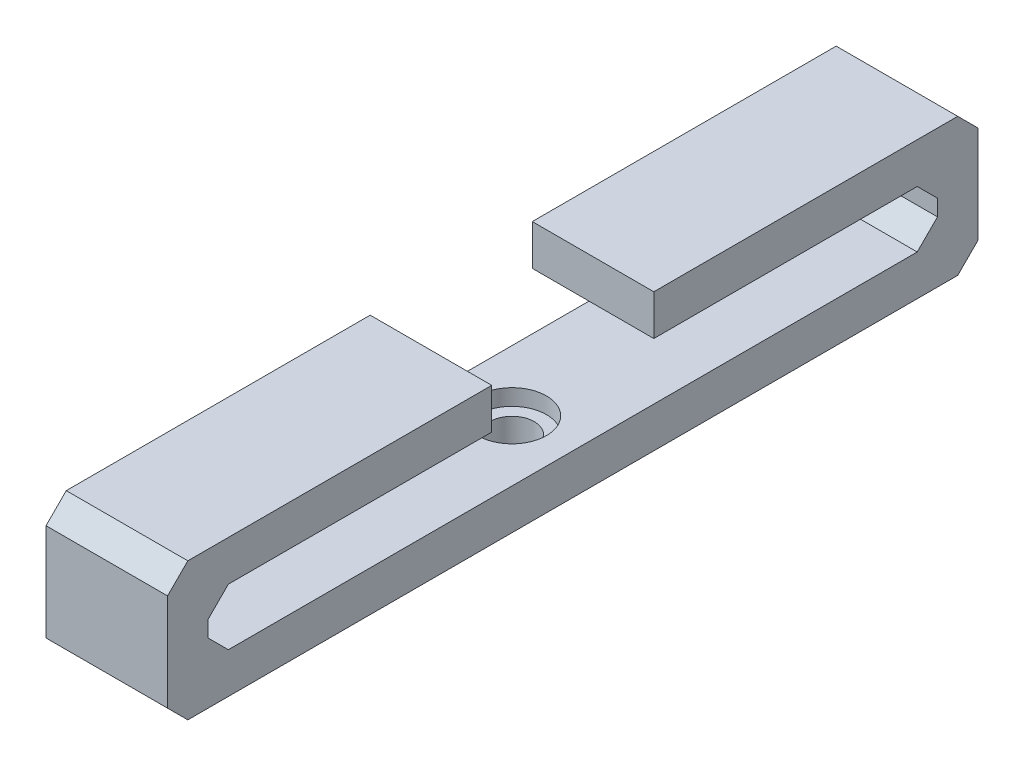
ISO-10303-21;
HEADER;
FILE_DESCRIPTION(('STEP AP214'),'2;1');
FILE_NAME('part.step','',(''),(''),'','','');
FILE_SCHEMA(('AUTOMOTIVE_DESIGN { 1 0 10303 214 1 1 1 1 }'));
ENDSEC;
DATA;
#1=APPLICATION_CONTEXT('core data for automotive mechanical design processes');
#2=APPLICATION_PROTOCOL_DEFINITION('international standard','automotive_design',2000,#1);
#3=PRODUCT_CONTEXT('',#1,'mechanical');
#4=PRODUCT('Part','Part','',(#3));
#5=PRODUCT_RELATED_PRODUCT_CATEGORY('part','',(#4));
#6=PRODUCT_DEFINITION_FORMATION('','',#4);
#7=PRODUCT_DEFINITION_CONTEXT('part definition',#1,'design');
#8=PRODUCT_DEFINITION('design','',#6,#7);
#9=PRODUCT_DEFINITION_SHAPE('','',#8);
#10=(LENGTH_UNIT() NAMED_UNIT(*) SI_UNIT(.MILLI.,.METRE.));
#11=(NAMED_UNIT(*) PLANE_ANGLE_UNIT() SI_UNIT($,.RADIAN.));
#12=(NAMED_UNIT(*) SI_UNIT($,.STERADIAN.) SOLID_ANGLE_UNIT());
#13=UNCERTAINTY_MEASURE_WITH_UNIT(LENGTH_MEASURE(1.E-05),#10,'distance_accuracy_value','');
#14=(GEOMETRIC_REPRESENTATION_CONTEXT(3) GLOBAL_UNCERTAINTY_ASSIGNED_CONTEXT((#13)) GLOBAL_UNIT_ASSIGNED_CONTEXT((#10,
#11,#12)) REPRESENTATION_CONTEXT('',''));
#15=CARTESIAN_POINT('',(0.,0.,0.));
#16=DIRECTION('',(0.,0.,1.));
#17=DIRECTION('',(1.,0.,0.));
#18=AXIS2_PLACEMENT_3D('',#15,#16,#17);
#19=CARTESIAN_POINT('',(0.,0.,0.));
#20=DIRECTION('',(0.,1.,0.));
#21=DIRECTION('',(0.,0.,1.));
#22=AXIS2_PLACEMENT_3D('',#19,#20,#21);
#23=CYLINDRICAL_SURFACE('',#22,2.75);
#24=CARTESIAN_POINT('',(0.,0.,0.));
#25=DIRECTION('',(0.,1.,0.));
#26=DIRECTION('',(0.,0.,1.));
#27=AXIS2_PLACEMENT_3D('',#24,#25,#26);
#28=CIRCLE('',#27,2.75);
#29=CARTESIAN_POINT('',(0.,0.,2.75));
#30=VERTEX_POINT('',#29);
#31=EDGE_CURVE('E369',#30,#30,#28,.T.);
#32=ORIENTED_EDGE('',*,*,#31,.F.);
#33=EDGE_LOOP('',(#32));
#34=FACE_BOUND('',#33,.T.);
#35=CARTESIAN_POINT('',(0.,3.,0.));
#36=DIRECTION('',(0.,1.,0.));
#37=DIRECTION('',(0.,0.,1.));
#38=AXIS2_PLACEMENT_3D('',#35,#36,#37);
#39=CIRCLE('',#38,2.75);
#40=CARTESIAN_POINT('',(0.,3.,2.75));
#41=VERTEX_POINT('',#40);
#42=EDGE_CURVE('E46',#41,#41,#39,.F.);
#43=ORIENTED_EDGE('',*,*,#42,.F.);
#44=EDGE_LOOP('',(#43));
#45=FACE_BOUND('',#44,.T.);
#46=ADVANCED_FACE('F41',(#34,#45),#23,.F.);
#47=CARTESIAN_POINT('',(7.5,17.,-50.));
#48=DIRECTION('',(0.,-1.,0.));
#49=DIRECTION('',(0.,0.,-1.));
#50=AXIS2_PLACEMENT_3D('',#47,#48,#49);
#51=PLANE('',#50);
#52=DIRECTION('',(0.,0.,1.));
#53=VECTOR('',#52,1.);
#54=CARTESIAN_POINT('',(7.5,17.,-50.));
#55=LINE('',#54,#53);
#56=CARTESIAN_POINT('',(7.5,17.,-47.5));
#57=VERTEX_POINT('',#56);
#58=CARTESIAN_POINT('',(7.5,17.,-10.));
#59=VERTEX_POINT('',#58);
#60=EDGE_CURVE('E180',#57,#59,#55,.T.);
#61=ORIENTED_EDGE('',*,*,#60,.F.);
#62=DIRECTION('',(-1.,0.,0.));
#63=VECTOR('',#62,1.);
#64=CARTESIAN_POINT('',(7.5,17.,-47.5));
#65=LINE('',#64,#63);
#66=CARTESIAN_POINT('',(-7.5,17.,-47.5));
#67=VERTEX_POINT('',#66);
#68=EDGE_CURVE('E284',#57,#67,#65,.T.);
#69=ORIENTED_EDGE('',*,*,#68,.T.);
#70=DIRECTION('',(0.,0.,1.));
#71=VECTOR('',#70,1.);
#72=CARTESIAN_POINT('',(-7.5,17.,-50.));
#73=LINE('',#72,#71);
#74=CARTESIAN_POINT('',(-7.5,17.,-10.));
#75=VERTEX_POINT('',#74);
#76=EDGE_CURVE('E209',#67,#75,#73,.T.);
#77=ORIENTED_EDGE('',*,*,#76,.T.);
#78=DIRECTION('',(-1.,0.,0.));
#79=VECTOR('',#78,1.);
#80=CARTESIAN_POINT('',(7.5,17.,-10.));
#81=LINE('',#80,#79);
#82=EDGE_CURVE('E200',#59,#75,#81,.T.);
#83=ORIENTED_EDGE('',*,*,#82,.F.);
#84=EDGE_LOOP('',(#61,#69,#77,#83));
#85=FACE_BOUND('',#84,.T.);
#86=ADVANCED_FACE('F207',(#85),#51,.F.);
#87=CARTESIAN_POINT('',(7.5,17.,-10.));
#88=DIRECTION('',(0.,0.,-1.));
#89=DIRECTION('',(0.,1.,0.));
#90=AXIS2_PLACEMENT_3D('',#87,#88,#89);
#91=PLANE('',#90);
#92=DIRECTION('',(0.,-1.,0.));
#93=VECTOR('',#92,1.);
#94=CARTESIAN_POINT('',(-7.5,17.,-10.));
#95=LINE('',#94,#93);
#96=CARTESIAN_POINT('',(-7.5,12.,-10.));
#97=VERTEX_POINT('',#96);
#98=EDGE_CURVE('E368',#75,#97,#95,.T.);
#99=ORIENTED_EDGE('',*,*,#98,.T.);
#100=DIRECTION('',(-1.,0.,0.));
#101=VECTOR('',#100,1.);
#102=CARTESIAN_POINT('',(7.5,12.,-10.));
#103=LINE('',#102,#101);
#104=CARTESIAN_POINT('',(7.5,12.,-10.));
#105=VERTEX_POINT('',#104);
#106=EDGE_CURVE('E202',#105,#97,#103,.T.);
#107=ORIENTED_EDGE('',*,*,#106,.F.);
#108=DIRECTION('',(0.,-1.,0.));
#109=VECTOR('',#108,1.);
#110=CARTESIAN_POINT('',(7.5,17.,-10.));
#111=LINE('',#110,#109);
#112=EDGE_CURVE('E185',#59,#105,#111,.T.);
#113=ORIENTED_EDGE('',*,*,#112,.F.);
#114=ORIENTED_EDGE('',*,*,#82,.T.);
#115=EDGE_LOOP('',(#99,#107,#113,#114));
#116=FACE_BOUND('',#115,.T.);
#117=ADVANCED_FACE('F199',(#116),#91,.F.);
#118=CARTESIAN_POINT('',(7.5,12.,-10.));
#119=DIRECTION('',(0.,1.,0.));
#120=DIRECTION('',(0.,0.,1.));
#121=AXIS2_PLACEMENT_3D('',#118,#119,#120);
#122=PLANE('',#121);
#123=DIRECTION('',(0.,0.,-1.));
#124=VECTOR('',#123,1.);
#125=CARTESIAN_POINT('',(-7.5,12.,-10.));
#126=LINE('',#125,#124);
#127=CARTESIAN_POINT('',(-7.5,12.,-42.5));
#128=VERTEX_POINT('',#127);
#129=EDGE_CURVE('E372',#97,#128,#126,.T.);
#130=ORIENTED_EDGE('',*,*,#129,.T.);
#131=DIRECTION('',(1.,0.,0.));
#132=VECTOR('',#131,1.);
#133=CARTESIAN_POINT('',(7.5,12.,-42.5));
#134=LINE('',#133,#132);
#135=CARTESIAN_POINT('',(7.5,12.,-42.5));
#136=VERTEX_POINT('',#135);
#137=EDGE_CURVE('E281',#128,#136,#134,.T.);
#138=ORIENTED_EDGE('',*,*,#137,.T.);
#139=DIRECTION('',(0.,0.,-1.));
#140=VECTOR('',#139,1.);
#141=CARTESIAN_POINT('',(7.5,12.,-10.));
#142=LINE('',#141,#140);
#143=EDGE_CURVE('E205',#105,#136,#142,.T.);
#144=ORIENTED_EDGE('',*,*,#143,.F.);
#145=ORIENTED_EDGE('',*,*,#106,.T.);
#146=EDGE_LOOP('',(#130,#138,#144,#145));
#147=FACE_BOUND('',#146,.T.);
#148=ADVANCED_FACE('F486',(#147),#122,.F.);
#149=CARTESIAN_POINT('',(7.5,12.,-45.));
#150=DIRECTION('',(0.,0.,-1.));
#151=DIRECTION('',(-1.,0.,0.));
#152=AXIS2_PLACEMENT_3D('',#149,#150,#151);
#153=PLANE('',#152);
#154=DIRECTION('',(0.,-1.,0.));
#155=VECTOR('',#154,1.);
#156=CARTESIAN_POINT('',(-7.5,12.,-45.));
#157=LINE('',#156,#155);
#158=CARTESIAN_POINT('',(-7.5,9.49999999999998,-45.));
#159=VERTEX_POINT('',#158);
#160=CARTESIAN_POINT('',(-7.5,7.5,-45.));
#161=VERTEX_POINT('',#160);
#162=EDGE_CURVE('E376',#159,#161,#157,.T.);
#163=ORIENTED_EDGE('',*,*,#162,.T.);
#164=DIRECTION('',(1.,0.,0.));
#165=VECTOR('',#164,1.);
#166=CARTESIAN_POINT('',(7.5,7.5,-45.));
#167=LINE('',#166,#165);
#168=CARTESIAN_POINT('',(7.5,7.5,-45.));
#169=VERTEX_POINT('',#168);
#170=EDGE_CURVE('E265',#161,#169,#167,.T.);
#171=ORIENTED_EDGE('',*,*,#170,.T.);
#172=DIRECTION('',(0.,-1.,0.));
#173=VECTOR('',#172,1.);
#174=CARTESIAN_POINT('',(7.5,12.,-45.));
#175=LINE('',#174,#173);
#176=CARTESIAN_POINT('',(7.5,9.49999999999998,-45.));
#177=VERTEX_POINT('',#176);
#178=EDGE_CURVE('E536',#177,#169,#175,.T.);
#179=ORIENTED_EDGE('',*,*,#178,.F.);
#180=DIRECTION('',(-1.,0.,0.));
#181=VECTOR('',#180,1.);
#182=CARTESIAN_POINT('',(-7.5,9.49999999999998,-45.));
#183=LINE('',#182,#181);
#184=EDGE_CURVE('E261',#177,#159,#183,.T.);
#185=ORIENTED_EDGE('',*,*,#184,.T.);
#186=EDGE_LOOP('',(#163,#171,#179,#185));
#187=FACE_BOUND('',#186,.T.);
#188=ADVANCED_FACE('F482',(#187),#153,.F.);
#189=CARTESIAN_POINT('',(7.5,5.,-45.));
#190=DIRECTION('',(0.,-1.,0.));
#191=DIRECTION('',(0.,0.,-1.));
#192=AXIS2_PLACEMENT_3D('',#189,#190,#191);
#193=PLANE('',#192);
#194=CARTESIAN_POINT('',(0.,5.,0.));
#195=DIRECTION('',(0.,1.,0.));
#196=DIRECTION('',(0.,0.,1.));
#197=AXIS2_PLACEMENT_3D('',#194,#195,#196);
#198=CIRCLE('',#197,4.25);
#199=CARTESIAN_POINT('',(0.,5.,4.25));
#200=VERTEX_POINT('',#199);
#201=EDGE_CURVE('E545',#200,#200,#198,.T.);
#202=ORIENTED_EDGE('',*,*,#201,.F.);
#203=EDGE_LOOP('',(#202));
#204=FACE_BOUND('',#203,.T.);
#205=DIRECTION('',(0.,0.,1.));
#206=VECTOR('',#205,1.);
#207=CARTESIAN_POINT('',(7.5,5.,-45.));
#208=LINE('',#207,#206);
#209=CARTESIAN_POINT('',(7.5,5.,-42.5));
#210=VERTEX_POINT('',#209);
#211=CARTESIAN_POINT('',(7.5,5.,42.5));
#212=VERTEX_POINT('',#211);
#213=EDGE_CURVE('E350',#210,#212,#208,.T.);
#214=ORIENTED_EDGE('',*,*,#213,.F.);
#215=DIRECTION('',(-1.,0.,0.));
#216=VECTOR('',#215,1.);
#217=CARTESIAN_POINT('',(-7.5,5.,-42.5));
#218=LINE('',#217,#216);
#219=CARTESIAN_POINT('',(-7.5,5.,-42.5));
#220=VERTEX_POINT('',#219);
#221=EDGE_CURVE('E257',#210,#220,#218,.T.);
#222=ORIENTED_EDGE('',*,*,#221,.T.);
#223=DIRECTION('',(0.,0.,1.));
#224=VECTOR('',#223,1.);
#225=CARTESIAN_POINT('',(-7.5,5.,-45.));
#226=LINE('',#225,#224);
#227=CARTESIAN_POINT('',(-7.5,5.,42.5));
#228=VERTEX_POINT('',#227);
#229=EDGE_CURVE('E331',#220,#228,#226,.T.);
#230=ORIENTED_EDGE('',*,*,#229,.T.);
#231=DIRECTION('',(1.,0.,0.));
#232=VECTOR('',#231,1.);
#233=CARTESIAN_POINT('',(7.5,5.,42.5));
#234=LINE('',#233,#232);
#235=EDGE_CURVE('E254',#228,#212,#234,.T.);
#236=ORIENTED_EDGE('',*,*,#235,.T.);
#237=EDGE_LOOP('',(#214,#222,#230,#236));
#238=FACE_BOUND('',#237,.T.);
#239=ADVANCED_FACE('F479',(#204,#238),#193,.F.);
#240=CARTESIAN_POINT('',(7.5,12.,45.));
#241=DIRECTION('',(0.,0.,1.));
#242=DIRECTION('',(1.,0.,0.));
#243=AXIS2_PLACEMENT_3D('',#240,#241,#242);
#244=PLANE('',#243);
#245=DIRECTION('',(0.,1.,0.));
#246=VECTOR('',#245,1.);
#247=CARTESIAN_POINT('',(7.5,12.,45.));
#248=LINE('',#247,#246);
#249=CARTESIAN_POINT('',(7.5,7.50000000000001,45.));
#250=VERTEX_POINT('',#249);
#251=CARTESIAN_POINT('',(7.5,9.49999999999999,45.));
#252=VERTEX_POINT('',#251);
#253=EDGE_CURVE('E338',#250,#252,#248,.T.);
#254=ORIENTED_EDGE('',*,*,#253,.F.);
#255=DIRECTION('',(-1.,0.,0.));
#256=VECTOR('',#255,1.);
#257=CARTESIAN_POINT('',(-7.5,7.50000000000001,45.));
#258=LINE('',#257,#256);
#259=CARTESIAN_POINT('',(-7.5,7.50000000000001,45.));
#260=VERTEX_POINT('',#259);
#261=EDGE_CURVE('E277',#250,#260,#258,.T.);
#262=ORIENTED_EDGE('',*,*,#261,.T.);
#263=DIRECTION('',(0.,1.,0.));
#264=VECTOR('',#263,1.);
#265=CARTESIAN_POINT('',(-7.5,12.,45.));
#266=LINE('',#265,#264);
#267=CARTESIAN_POINT('',(-7.5,9.49999999999999,45.));
#268=VERTEX_POINT('',#267);
#269=EDGE_CURVE('E319',#260,#268,#266,.T.);
#270=ORIENTED_EDGE('',*,*,#269,.T.);
#271=DIRECTION('',(1.,0.,0.));
#272=VECTOR('',#271,1.);
#273=CARTESIAN_POINT('',(7.5,9.49999999999999,45.));
#274=LINE('',#273,#272);
#275=EDGE_CURVE('E274',#268,#252,#274,.T.);
#276=ORIENTED_EDGE('',*,*,#275,.T.);
#277=EDGE_LOOP('',(#254,#262,#270,#276));
#278=FACE_BOUND('',#277,.T.);
#279=ADVANCED_FACE('F327',(#278),#244,.F.);
#280=CARTESIAN_POINT('',(7.5,12.,10.));
#281=DIRECTION('',(0.,1.,0.));
#282=DIRECTION('',(0.,0.,1.));
#283=AXIS2_PLACEMENT_3D('',#280,#281,#282);
#284=PLANE('',#283);
#285=DIRECTION('',(0.,0.,-1.));
#286=VECTOR('',#285,1.);
#287=CARTESIAN_POINT('',(7.5,12.,10.));
#288=LINE('',#287,#286);
#289=CARTESIAN_POINT('',(7.5,12.,42.5));
#290=VERTEX_POINT('',#289);
#291=CARTESIAN_POINT('',(7.5,12.,10.));
#292=VERTEX_POINT('',#291);
#293=EDGE_CURVE('E336',#290,#292,#288,.T.);
#294=ORIENTED_EDGE('',*,*,#293,.F.);
#295=DIRECTION('',(-1.,0.,0.));
#296=VECTOR('',#295,1.);
#297=CARTESIAN_POINT('',(-7.5,12.,42.5));
#298=LINE('',#297,#296);
#299=CARTESIAN_POINT('',(-7.5,12.,42.5));
#300=VERTEX_POINT('',#299);
#301=EDGE_CURVE('E287',#290,#300,#298,.T.);
#302=ORIENTED_EDGE('',*,*,#301,.T.);
#303=DIRECTION('',(0.,0.,-1.));
#304=VECTOR('',#303,1.);
#305=CARTESIAN_POINT('',(-7.5,12.,10.));
#306=LINE('',#305,#304);
#307=CARTESIAN_POINT('',(-7.5,12.,10.));
#308=VERTEX_POINT('',#307);
#309=EDGE_CURVE('E321',#300,#308,#306,.T.);
#310=ORIENTED_EDGE('',*,*,#309,.T.);
#311=DIRECTION('',(-1.,0.,0.));
#312=VECTOR('',#311,1.);
#313=CARTESIAN_POINT('',(7.5,12.,10.));
#314=LINE('',#313,#312);
#315=EDGE_CURVE('E218',#292,#308,#314,.T.);
#316=ORIENTED_EDGE('',*,*,#315,.F.);
#317=EDGE_LOOP('',(#294,#302,#310,#316));
#318=FACE_BOUND('',#317,.T.);
#319=ADVANCED_FACE('F340',(#318),#284,.F.);
#320=CARTESIAN_POINT('',(7.5,17.,10.));
#321=DIRECTION('',(0.,0.,1.));
#322=DIRECTION('',(0.,-1.,0.));
#323=AXIS2_PLACEMENT_3D('',#320,#321,#322);
#324=PLANE('',#323);
#325=DIRECTION('',(0.,1.,0.));
#326=VECTOR('',#325,1.);
#327=CARTESIAN_POINT('',(-7.5,17.,10.));
#328=LINE('',#327,#326);
#329=CARTESIAN_POINT('',(-7.5,17.,10.));
#330=VERTEX_POINT('',#329);
#331=EDGE_CURVE('E385',#308,#330,#328,.T.);
#332=ORIENTED_EDGE('',*,*,#331,.T.);
#333=DIRECTION('',(-1.,0.,0.));
#334=VECTOR('',#333,1.);
#335=CARTESIAN_POINT('',(7.5,17.,10.));
#336=LINE('',#335,#334);
#337=CARTESIAN_POINT('',(7.5,17.,10.));
#338=VERTEX_POINT('',#337);
#339=EDGE_CURVE('E365',#338,#330,#336,.T.);
#340=ORIENTED_EDGE('',*,*,#339,.F.);
#341=DIRECTION('',(0.,1.,0.));
#342=VECTOR('',#341,1.);
#343=CARTESIAN_POINT('',(7.5,17.,10.));
#344=LINE('',#343,#342);
#345=EDGE_CURVE('E344',#292,#338,#344,.T.);
#346=ORIENTED_EDGE('',*,*,#345,.F.);
#347=ORIENTED_EDGE('',*,*,#315,.T.);
#348=EDGE_LOOP('',(#332,#340,#346,#347));
#349=FACE_BOUND('',#348,.T.);
#350=ADVANCED_FACE('F406',(#349),#324,.F.);
#351=CARTESIAN_POINT('',(7.5,17.,50.));
#352=DIRECTION('',(0.,-1.,0.));
#353=DIRECTION('',(0.,0.,-1.));
#354=AXIS2_PLACEMENT_3D('',#351,#352,#353);
#355=PLANE('',#354);
#356=DIRECTION('',(0.,0.,1.));
#357=VECTOR('',#356,1.);
#358=CARTESIAN_POINT('',(-7.5,17.,50.));
#359=LINE('',#358,#357);
#360=CARTESIAN_POINT('',(-7.5,17.,47.5));
#361=VERTEX_POINT('',#360);
#362=EDGE_CURVE('E388',#330,#361,#359,.T.);
#363=ORIENTED_EDGE('',*,*,#362,.T.);
#364=DIRECTION('',(1.,0.,0.));
#365=VECTOR('',#364,1.);
#366=CARTESIAN_POINT('',(7.5,17.,47.5));
#367=LINE('',#366,#365);
#368=CARTESIAN_POINT('',(7.5,17.,47.5));
#369=VERTEX_POINT('',#368);
#370=EDGE_CURVE('E291',#361,#369,#367,.T.);
#371=ORIENTED_EDGE('',*,*,#370,.T.);
#372=DIRECTION('',(0.,0.,1.));
#373=VECTOR('',#372,1.);
#374=CARTESIAN_POINT('',(7.5,17.,50.));
#375=LINE('',#374,#373);
#376=EDGE_CURVE('E348',#338,#369,#375,.T.);
#377=ORIENTED_EDGE('',*,*,#376,.F.);
#378=ORIENTED_EDGE('',*,*,#339,.T.);
#379=EDGE_LOOP('',(#363,#371,#377,#378));
#380=FACE_BOUND('',#379,.T.);
#381=ADVANCED_FACE('F412',(#380),#355,.F.);
#382=CARTESIAN_POINT('',(7.5,0.,50.));
#383=DIRECTION('',(0.,0.,-1.));
#384=DIRECTION('',(-1.,0.,0.));
#385=AXIS2_PLACEMENT_3D('',#382,#383,#384);
#386=PLANE('',#385);
#387=DIRECTION('',(0.,-1.,0.));
#388=VECTOR('',#387,1.);
#389=CARTESIAN_POINT('',(-7.5,0.,50.));
#390=LINE('',#389,#388);
#391=CARTESIAN_POINT('',(-7.5,14.5,50.));
#392=VERTEX_POINT('',#391);
#393=CARTESIAN_POINT('',(-7.5,2.50000000000003,50.));
#394=VERTEX_POINT('',#393);
#395=EDGE_CURVE('E392',#392,#394,#390,.T.);
#396=ORIENTED_EDGE('',*,*,#395,.T.);
#397=DIRECTION('',(1.,0.,0.));
#398=VECTOR('',#397,1.);
#399=CARTESIAN_POINT('',(7.5,2.50000000000003,50.));
#400=LINE('',#399,#398);
#401=CARTESIAN_POINT('',(7.5,2.50000000000003,50.));
#402=VERTEX_POINT('',#401);
#403=EDGE_CURVE('E59',#394,#402,#400,.T.);
#404=ORIENTED_EDGE('',*,*,#403,.T.);
#405=DIRECTION('',(0.,-1.,0.));
#406=VECTOR('',#405,1.);
#407=CARTESIAN_POINT('',(7.5,0.,50.));
#408=LINE('',#407,#406);
#409=CARTESIAN_POINT('',(7.5,14.5,50.));
#410=VERTEX_POINT('',#409);
#411=EDGE_CURVE('E356',#410,#402,#408,.T.);
#412=ORIENTED_EDGE('',*,*,#411,.F.);
#413=DIRECTION('',(-1.,0.,0.));
#414=VECTOR('',#413,1.);
#415=CARTESIAN_POINT('',(7.5,14.5,50.));
#416=LINE('',#415,#414);
#417=EDGE_CURVE('E268',#410,#392,#416,.T.);
#418=ORIENTED_EDGE('',*,*,#417,.T.);
#419=EDGE_LOOP('',(#396,#404,#412,#418));
#420=FACE_BOUND('',#419,.T.);
#421=ADVANCED_FACE('F416',(#420),#386,.F.);
#422=CARTESIAN_POINT('',(7.5,0.,50.));
#423=DIRECTION('',(0.,1.,0.));
#424=DIRECTION('',(0.,0.,1.));
#425=AXIS2_PLACEMENT_3D('',#422,#423,#424);
#426=PLANE('',#425);
#427=ORIENTED_EDGE('',*,*,#31,.T.);
#428=EDGE_LOOP('',(#427));
#429=FACE_BOUND('',#428,.T.);
#430=DIRECTION('',(0.,0.,-1.));
#431=VECTOR('',#430,1.);
#432=CARTESIAN_POINT('',(-7.5,0.,50.));
#433=LINE('',#432,#431);
#434=CARTESIAN_POINT('',(-7.5,0.,47.5));
#435=VERTEX_POINT('',#434);
#436=CARTESIAN_POINT('',(-7.5,0.,-47.5));
#437=VERTEX_POINT('',#436);
#438=EDGE_CURVE('E395',#435,#437,#433,.T.);
#439=ORIENTED_EDGE('',*,*,#438,.T.);
#440=DIRECTION('',(1.,0.,0.));
#441=VECTOR('',#440,1.);
#442=CARTESIAN_POINT('',(7.5,0.,-47.5));
#443=LINE('',#442,#441);
#444=CARTESIAN_POINT('',(7.5,0.,-47.5));
#445=VERTEX_POINT('',#444);
#446=EDGE_CURVE('E241',#437,#445,#443,.T.);
#447=ORIENTED_EDGE('',*,*,#446,.T.);
#448=DIRECTION('',(0.,0.,-1.));
#449=VECTOR('',#448,1.);
#450=CARTESIAN_POINT('',(7.5,0.,50.));
#451=LINE('',#450,#449);
#452=CARTESIAN_POINT('',(7.5,0.,47.5));
#453=VERTEX_POINT('',#452);
#454=EDGE_CURVE('E359',#453,#445,#451,.T.);
#455=ORIENTED_EDGE('',*,*,#454,.F.);
#456=DIRECTION('',(-1.,0.,0.));
#457=VECTOR('',#456,1.);
#458=CARTESIAN_POINT('',(7.5,0.,47.5));
#459=LINE('',#458,#457);
#460=EDGE_CURVE('E237',#453,#435,#459,.T.);
#461=ORIENTED_EDGE('',*,*,#460,.T.);
#462=EDGE_LOOP('',(#439,#447,#455,#461));
#463=FACE_BOUND('',#462,.T.);
#464=ADVANCED_FACE('F424',(#429,#463),#426,.F.);
#465=CARTESIAN_POINT('',(7.5,0.,-50.));
#466=DIRECTION('',(0.,0.,1.));
#467=DIRECTION('',(1.,0.,0.));
#468=AXIS2_PLACEMENT_3D('',#465,#466,#467);
#469=PLANE('',#468);
#470=DIRECTION('',(0.,1.,0.));
#471=VECTOR('',#470,1.);
#472=CARTESIAN_POINT('',(7.5,0.,-50.));
#473=LINE('',#472,#471);
#474=CARTESIAN_POINT('',(7.5,2.50000000000002,-50.));
#475=VERTEX_POINT('',#474);
#476=CARTESIAN_POINT('',(7.5,14.5,-50.));
#477=VERTEX_POINT('',#476);
#478=EDGE_CURVE('E362',#475,#477,#473,.T.);
#479=ORIENTED_EDGE('',*,*,#478,.F.);
#480=DIRECTION('',(-1.,0.,0.));
#481=VECTOR('',#480,1.);
#482=CARTESIAN_POINT('',(7.5,2.50000000000002,-50.));
#483=LINE('',#482,#481);
#484=CARTESIAN_POINT('',(-7.5,2.50000000000002,-50.));
#485=VERTEX_POINT('',#484);
#486=EDGE_CURVE('E216',#475,#485,#483,.T.);
#487=ORIENTED_EDGE('',*,*,#486,.T.);
#488=DIRECTION('',(0.,1.,0.));
#489=VECTOR('',#488,1.);
#490=CARTESIAN_POINT('',(-7.5,0.,-50.));
#491=LINE('',#490,#489);
#492=CARTESIAN_POINT('',(-7.5,14.5,-50.));
#493=VERTEX_POINT('',#492);
#494=EDGE_CURVE('E195',#485,#493,#491,.T.);
#495=ORIENTED_EDGE('',*,*,#494,.T.);
#496=DIRECTION('',(1.,0.,0.));
#497=VECTOR('',#496,1.);
#498=CARTESIAN_POINT('',(7.5,14.5,-50.));
#499=LINE('',#498,#497);
#500=EDGE_CURVE('E212',#493,#477,#499,.T.);
#501=ORIENTED_EDGE('',*,*,#500,.T.);
#502=EDGE_LOOP('',(#479,#487,#495,#501));
#503=FACE_BOUND('',#502,.T.);
#504=ADVANCED_FACE('F432',(#503),#469,.F.);
#505=CARTESIAN_POINT('',(7.5,0.,0.));
#506=DIRECTION('',(1.,0.,0.));
#507=DIRECTION('',(0.,0.,-1.));
#508=AXIS2_PLACEMENT_3D('',#505,#506,#507);
#509=PLANE('',#508);
#510=ORIENTED_EDGE('',*,*,#454,.T.);
#511=DIRECTION('',(0.,-0.707106781186548,0.707106781186548));
#512=VECTOR('',#511,1.);
#513=CARTESIAN_POINT('',(7.5,-23.75,-23.75));
#514=LINE('',#513,#512);
#515=EDGE_CURVE('E251',#445,#475,#514,.F.);
#516=ORIENTED_EDGE('',*,*,#515,.T.);
#517=ORIENTED_EDGE('',*,*,#478,.T.);
#518=DIRECTION('',(0.,-0.707106781186549,-0.707106781186546));
#519=VECTOR('',#518,1.);
#520=CARTESIAN_POINT('',(7.5,32.25,-32.2500000000001));
#521=LINE('',#520,#519);
#522=EDGE_CURVE('E189',#477,#57,#521,.F.);
#523=ORIENTED_EDGE('',*,*,#522,.T.);
#524=ORIENTED_EDGE('',*,*,#60,.T.);
#525=ORIENTED_EDGE('',*,*,#112,.T.);
#526=ORIENTED_EDGE('',*,*,#143,.T.);
#527=DIRECTION('',(0.,0.707106781186551,0.707106781186544));
#528=VECTOR('',#527,1.);
#529=CARTESIAN_POINT('',(7.5,9.49999999999998,-45.));
#530=LINE('',#529,#528);
#531=EDGE_CURVE('E309',#136,#177,#530,.F.);
#532=ORIENTED_EDGE('',*,*,#531,.T.);
#533=ORIENTED_EDGE('',*,*,#178,.T.);
#534=DIRECTION('',(0.,0.707106781186545,-0.70710678118655));
#535=VECTOR('',#534,1.);
#536=CARTESIAN_POINT('',(7.5,5.,-42.5));
#537=LINE('',#536,#535);
#538=EDGE_CURVE('E297',#169,#210,#537,.F.);
#539=ORIENTED_EDGE('',*,*,#538,.T.);
#540=ORIENTED_EDGE('',*,*,#213,.T.);
#541=DIRECTION('',(0.,-0.707106781186551,-0.707106781186544));
#542=VECTOR('',#541,1.);
#543=CARTESIAN_POINT('',(7.5,7.50000000000001,45.));
#544=LINE('',#543,#542);
#545=EDGE_CURVE('E303',#212,#250,#544,.F.);
#546=ORIENTED_EDGE('',*,*,#545,.T.);
#547=ORIENTED_EDGE('',*,*,#253,.T.);
#548=DIRECTION('',(0.,-0.707106781186546,0.707106781186549));
#549=VECTOR('',#548,1.);
#550=CARTESIAN_POINT('',(7.5,12.,42.5));
#551=LINE('',#550,#549);
#552=EDGE_CURVE('E11',#252,#290,#551,.F.);
#553=ORIENTED_EDGE('',*,*,#552,.T.);
#554=ORIENTED_EDGE('',*,*,#293,.T.);
#555=ORIENTED_EDGE('',*,*,#345,.T.);
#556=ORIENTED_EDGE('',*,*,#376,.T.);
#557=DIRECTION('',(0.,0.707106781186546,-0.707106781186549));
#558=VECTOR('',#557,1.);
#559=CARTESIAN_POINT('',(7.5,32.25,32.2499999999999));
#560=LINE('',#559,#558);
#561=EDGE_CURVE('E66',#369,#410,#560,.F.);
#562=ORIENTED_EDGE('',*,*,#561,.T.);
#563=ORIENTED_EDGE('',*,*,#411,.T.);
#564=DIRECTION('',(0.,0.707106781186549,0.707106781186546));
#565=VECTOR('',#564,1.);
#566=CARTESIAN_POINT('',(7.5,-23.75,23.7500000000001));
#567=LINE('',#566,#565);
#568=EDGE_CURVE('E248',#402,#453,#567,.F.);
#569=ORIENTED_EDGE('',*,*,#568,.T.);
#570=EDGE_LOOP('',(#510,#516,#517,#523,#524,#525,#526,#532,#533,#539,#540,#546,#547,#553,#554,
#555,#556,#562,#563,#569));
#571=FACE_BOUND('',#570,.T.);
#572=ADVANCED_FACE('F183',(#571),#509,.T.);
#573=CARTESIAN_POINT('',(-7.5,0.,0.));
#574=DIRECTION('',(1.,0.,0.));
#575=DIRECTION('',(0.,0.,-1.));
#576=AXIS2_PLACEMENT_3D('',#573,#574,#575);
#577=PLANE('',#576);
#578=ORIENTED_EDGE('',*,*,#494,.F.);
#579=DIRECTION('',(0.,0.707106781186548,-0.707106781186548));
#580=VECTOR('',#579,1.);
#581=CARTESIAN_POINT('',(-7.5,2.50000000000002,-50.));
#582=LINE('',#581,#580);
#583=EDGE_CURVE('E234',#485,#437,#582,.F.);
#584=ORIENTED_EDGE('',*,*,#583,.T.);
#585=ORIENTED_EDGE('',*,*,#438,.F.);
#586=DIRECTION('',(0.,-0.707106781186549,-0.707106781186546));
#587=VECTOR('',#586,1.);
#588=CARTESIAN_POINT('',(-7.5,0.,47.5));
#589=LINE('',#588,#587);
#590=EDGE_CURVE('E231',#435,#394,#589,.F.);
#591=ORIENTED_EDGE('',*,*,#590,.T.);
#592=ORIENTED_EDGE('',*,*,#395,.F.);
#593=DIRECTION('',(0.,-0.707106781186546,0.707106781186549));
#594=VECTOR('',#593,1.);
#595=CARTESIAN_POINT('',(-7.5,14.5,50.));
#596=LINE('',#595,#594);
#597=EDGE_CURVE('E225',#392,#361,#596,.F.);
#598=ORIENTED_EDGE('',*,*,#597,.T.);
#599=ORIENTED_EDGE('',*,*,#362,.F.);
#600=ORIENTED_EDGE('',*,*,#331,.F.);
#601=ORIENTED_EDGE('',*,*,#309,.F.);
#602=DIRECTION('',(0.,0.707106781186546,-0.707106781186549));
#603=VECTOR('',#602,1.);
#604=CARTESIAN_POINT('',(-7.5,27.25,27.2499999999999));
#605=LINE('',#604,#603);
#606=EDGE_CURVE('E52',#300,#268,#605,.F.);
#607=ORIENTED_EDGE('',*,*,#606,.T.);
#608=ORIENTED_EDGE('',*,*,#269,.F.);
#609=DIRECTION('',(0.,0.707106781186551,0.707106781186544));
#610=VECTOR('',#609,1.);
#611=CARTESIAN_POINT('',(-7.5,-18.75,18.7500000000002));
#612=LINE('',#611,#610);
#613=EDGE_CURVE('E300',#260,#228,#612,.F.);
#614=ORIENTED_EDGE('',*,*,#613,.T.);
#615=ORIENTED_EDGE('',*,*,#229,.F.);
#616=DIRECTION('',(0.,-0.707106781186545,0.70710678118655));
#617=VECTOR('',#616,1.);
#618=CARTESIAN_POINT('',(-7.5,-18.75,-18.7499999999999));
#619=LINE('',#618,#617);
#620=EDGE_CURVE('E294',#220,#161,#619,.F.);
#621=ORIENTED_EDGE('',*,*,#620,.T.);
#622=ORIENTED_EDGE('',*,*,#162,.F.);
#623=DIRECTION('',(0.,-0.707106781186551,-0.707106781186544));
#624=VECTOR('',#623,1.);
#625=CARTESIAN_POINT('',(-7.5,27.2499999999999,-27.2500000000002));
#626=LINE('',#625,#624);
#627=EDGE_CURVE('E306',#159,#128,#626,.F.);
#628=ORIENTED_EDGE('',*,*,#627,.T.);
#629=ORIENTED_EDGE('',*,*,#129,.F.);
#630=ORIENTED_EDGE('',*,*,#98,.F.);
#631=ORIENTED_EDGE('',*,*,#76,.F.);
#632=DIRECTION('',(0.,0.707106781186549,0.707106781186546));
#633=VECTOR('',#632,1.);
#634=CARTESIAN_POINT('',(-7.5,17.,-47.5));
#635=LINE('',#634,#633);
#636=EDGE_CURVE('E228',#67,#493,#635,.F.);
#637=ORIENTED_EDGE('',*,*,#636,.T.);
#638=EDGE_LOOP('',(#578,#584,#585,#591,#592,#598,#599,#600,#601,#607,#608,#614,#615,#621,#622,
#628,#629,#630,#631,#637));
#639=FACE_BOUND('',#638,.T.);
#640=ADVANCED_FACE('F318',(#639),#577,.F.);
#641=CARTESIAN_POINT('',(7.5,2.50000000000002,-50.));
#642=DIRECTION('',(0.,0.707106781186547,0.707106781186547));
#643=DIRECTION('',(-1.,0.,0.));
#644=AXIS2_PLACEMENT_3D('',#641,#642,#643);
#645=PLANE('',#644);
#646=ORIENTED_EDGE('',*,*,#515,.F.);
#647=ORIENTED_EDGE('',*,*,#446,.F.);
#648=ORIENTED_EDGE('',*,*,#583,.F.);
#649=ORIENTED_EDGE('',*,*,#486,.F.);
#650=EDGE_LOOP('',(#646,#647,#648,#649));
#651=FACE_BOUND('',#650,.T.);
#652=ADVANCED_FACE('F430',(#651),#645,.F.);
#653=CARTESIAN_POINT('',(7.5,5.,-42.5));
#654=DIRECTION('',(0.,0.70710678118655,0.707106781186545));
#655=DIRECTION('',(1.,0.,0.));
#656=AXIS2_PLACEMENT_3D('',#653,#654,#655);
#657=PLANE('',#656);
#658=ORIENTED_EDGE('',*,*,#538,.F.);
#659=ORIENTED_EDGE('',*,*,#170,.F.);
#660=ORIENTED_EDGE('',*,*,#620,.F.);
#661=ORIENTED_EDGE('',*,*,#221,.F.);
#662=EDGE_LOOP('',(#658,#659,#660,#661));
#663=FACE_BOUND('',#662,.T.);
#664=ADVANCED_FACE('F499',(#663),#657,.T.);
#665=CARTESIAN_POINT('',(7.5,0.,47.5));
#666=DIRECTION('',(0.,0.707106781186546,-0.707106781186549));
#667=DIRECTION('',(-1.,0.,0.));
#668=AXIS2_PLACEMENT_3D('',#665,#666,#667);
#669=PLANE('',#668);
#670=ORIENTED_EDGE('',*,*,#568,.F.);
#671=ORIENTED_EDGE('',*,*,#403,.F.);
#672=ORIENTED_EDGE('',*,*,#590,.F.);
#673=ORIENTED_EDGE('',*,*,#460,.F.);
#674=EDGE_LOOP('',(#670,#671,#672,#673));
#675=FACE_BOUND('',#674,.T.);
#676=ADVANCED_FACE('F421',(#675),#669,.F.);
#677=CARTESIAN_POINT('',(7.5,7.50000000000001,45.));
#678=DIRECTION('',(0.,0.707106781186544,-0.707106781186551));
#679=DIRECTION('',(1.,0.,0.));
#680=AXIS2_PLACEMENT_3D('',#677,#678,#679);
#681=PLANE('',#680);
#682=ORIENTED_EDGE('',*,*,#545,.F.);
#683=ORIENTED_EDGE('',*,*,#235,.F.);
#684=ORIENTED_EDGE('',*,*,#613,.F.);
#685=ORIENTED_EDGE('',*,*,#261,.F.);
#686=EDGE_LOOP('',(#682,#683,#684,#685));
#687=FACE_BOUND('',#686,.T.);
#688=ADVANCED_FACE('F443',(#687),#681,.T.);
#689=CARTESIAN_POINT('',(7.5,9.49999999999998,-45.));
#690=DIRECTION('',(0.,-0.707106781186544,0.707106781186551));
#691=DIRECTION('',(1.,0.,0.));
#692=AXIS2_PLACEMENT_3D('',#689,#690,#691);
#693=PLANE('',#692);
#694=ORIENTED_EDGE('',*,*,#531,.F.);
#695=ORIENTED_EDGE('',*,*,#137,.F.);
#696=ORIENTED_EDGE('',*,*,#627,.F.);
#697=ORIENTED_EDGE('',*,*,#184,.F.);
#698=EDGE_LOOP('',(#694,#695,#696,#697));
#699=FACE_BOUND('',#698,.T.);
#700=ADVANCED_FACE('F437',(#699),#693,.T.);
#701=CARTESIAN_POINT('',(7.5,17.,-47.5));
#702=DIRECTION('',(0.,-0.707106781186545,0.707106781186549));
#703=DIRECTION('',(-1.,0.,0.));
#704=AXIS2_PLACEMENT_3D('',#701,#702,#703);
#705=PLANE('',#704);
#706=ORIENTED_EDGE('',*,*,#522,.F.);
#707=ORIENTED_EDGE('',*,*,#500,.F.);
#708=ORIENTED_EDGE('',*,*,#636,.F.);
#709=ORIENTED_EDGE('',*,*,#68,.F.);
#710=EDGE_LOOP('',(#706,#707,#708,#709));
#711=FACE_BOUND('',#710,.T.);
#712=ADVANCED_FACE('F435',(#711),#705,.F.);
#713=CARTESIAN_POINT('',(7.5,12.,42.5));
#714=DIRECTION('',(0.,-0.707106781186549,-0.707106781186545));
#715=DIRECTION('',(1.,0.,0.));
#716=AXIS2_PLACEMENT_3D('',#713,#714,#715);
#717=PLANE('',#716);
#718=ORIENTED_EDGE('',*,*,#552,.F.);
#719=ORIENTED_EDGE('',*,*,#275,.F.);
#720=ORIENTED_EDGE('',*,*,#606,.F.);
#721=ORIENTED_EDGE('',*,*,#301,.F.);
#722=EDGE_LOOP('',(#718,#719,#720,#721));
#723=FACE_BOUND('',#722,.T.);
#724=ADVANCED_FACE('F334',(#723),#717,.T.);
#725=CARTESIAN_POINT('',(7.5,14.5,50.));
#726=DIRECTION('',(0.,-0.707106781186549,-0.707106781186545));
#727=DIRECTION('',(-1.,0.,0.));
#728=AXIS2_PLACEMENT_3D('',#725,#726,#727);
#729=PLANE('',#728);
#730=ORIENTED_EDGE('',*,*,#561,.F.);
#731=ORIENTED_EDGE('',*,*,#370,.F.);
#732=ORIENTED_EDGE('',*,*,#597,.F.);
#733=ORIENTED_EDGE('',*,*,#417,.F.);
#734=EDGE_LOOP('',(#730,#731,#732,#733));
#735=FACE_BOUND('',#734,.T.);
#736=ADVANCED_FACE('F44',(#735),#729,.F.);
#737=CARTESIAN_POINT('',(0.,3.,0.));
#738=DIRECTION('',(0.,1.,0.));
#739=DIRECTION('',(0.,0.,1.));
#740=AXIS2_PLACEMENT_3D('',#737,#738,#739);
#741=PLANE('',#740);
#742=CARTESIAN_POINT('',(0.,3.,0.));
#743=DIRECTION('',(0.,1.,0.));
#744=DIRECTION('',(0.,0.,1.));
#745=AXIS2_PLACEMENT_3D('',#742,#743,#744);
#746=CIRCLE('',#745,4.25);
#747=CARTESIAN_POINT('',(0.,3.,4.25));
#748=VERTEX_POINT('',#747);
#749=EDGE_CURVE('E549',#748,#748,#746,.T.);
#750=ORIENTED_EDGE('',*,*,#749,.T.);
#751=EDGE_LOOP('',(#750));
#752=FACE_BOUND('',#751,.T.);
#753=ORIENTED_EDGE('',*,*,#42,.T.);
#754=EDGE_LOOP('',(#753));
#755=FACE_BOUND('',#754,.T.);
#756=ADVANCED_FACE('F558',(#752,#755),#741,.T.);
#757=CARTESIAN_POINT('',(0.,3.,0.));
#758=DIRECTION('',(0.,1.,0.));
#759=DIRECTION('',(0.,0.,1.));
#760=AXIS2_PLACEMENT_3D('',#757,#758,#759);
#761=CYLINDRICAL_SURFACE('',#760,4.25);
#762=ORIENTED_EDGE('',*,*,#749,.F.);
#763=EDGE_LOOP('',(#762));
#764=FACE_BOUND('',#763,.T.);
#765=ORIENTED_EDGE('',*,*,#201,.T.);
#766=EDGE_LOOP('',(#765));
#767=FACE_BOUND('',#766,.T.);
#768=ADVANCED_FACE('F458',(#764,#767),#761,.F.);
#769=CLOSED_SHELL('',(#46,#86,#117,#148,#188,#239,#279,#319,#350,#381,#421,#464,#504,#572,#640,
#652,#664,#676,#688,#700,#712,#724,#736,#756,#768));
#770=MANIFOLD_SOLID_BREP('B2',#769);
#771=ADVANCED_BREP_SHAPE_REPRESENTATION('',(#18,#770),#14);
#772=SHAPE_DEFINITION_REPRESENTATION(#9,#771);
ENDSEC;
END-ISO-10303-21;
